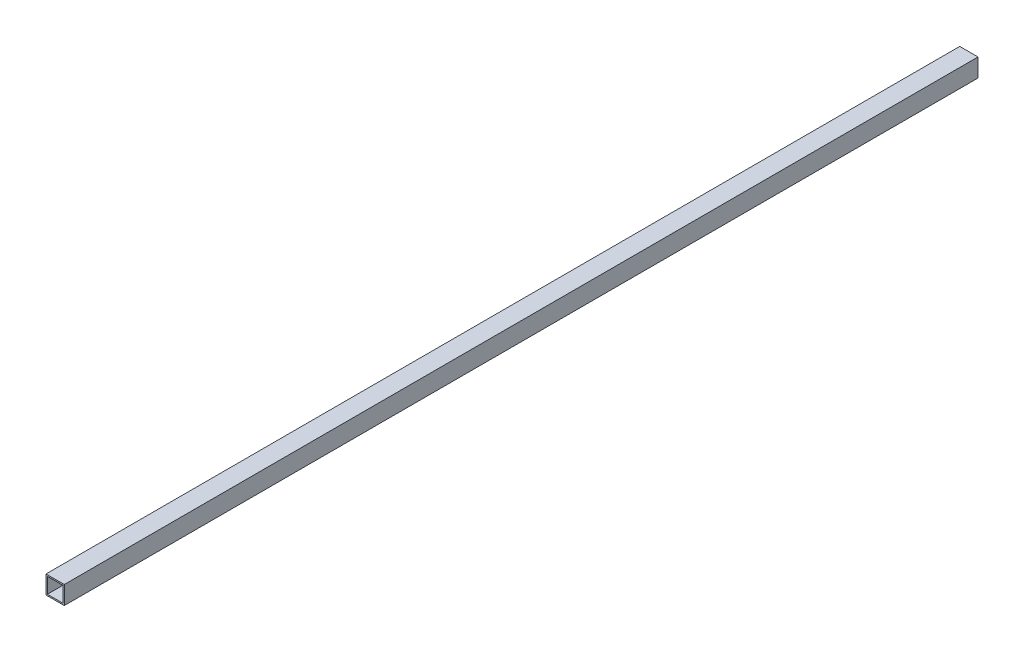
ISO-10303-21;
HEADER;
FILE_DESCRIPTION(('STEP AP214'),'2;1');
FILE_NAME('part.step','',(''),(''),'','','');
FILE_SCHEMA(('AUTOMOTIVE_DESIGN { 1 0 10303 214 1 1 1 1 }'));
ENDSEC;
DATA;
#1=APPLICATION_CONTEXT('core data for automotive mechanical design processes');
#2=APPLICATION_PROTOCOL_DEFINITION('international standard','automotive_design',2000,#1);
#3=PRODUCT_CONTEXT('',#1,'mechanical');
#4=PRODUCT('Part','Part','',(#3));
#5=PRODUCT_RELATED_PRODUCT_CATEGORY('part','',(#4));
#6=PRODUCT_DEFINITION_FORMATION('','',#4);
#7=PRODUCT_DEFINITION_CONTEXT('part definition',#1,'design');
#8=PRODUCT_DEFINITION('design','',#6,#7);
#9=PRODUCT_DEFINITION_SHAPE('','',#8);
#10=(LENGTH_UNIT() NAMED_UNIT(*) SI_UNIT(.MILLI.,.METRE.));
#11=(NAMED_UNIT(*) PLANE_ANGLE_UNIT() SI_UNIT($,.RADIAN.));
#12=(NAMED_UNIT(*) SI_UNIT($,.STERADIAN.) SOLID_ANGLE_UNIT());
#13=UNCERTAINTY_MEASURE_WITH_UNIT(LENGTH_MEASURE(1.E-05),#10,'distance_accuracy_value','');
#14=(GEOMETRIC_REPRESENTATION_CONTEXT(3) GLOBAL_UNCERTAINTY_ASSIGNED_CONTEXT((#13)) GLOBAL_UNIT_ASSIGNED_CONTEXT((#10,
#11,#12)) REPRESENTATION_CONTEXT('',''));
#15=CARTESIAN_POINT('',(0.,0.,0.));
#16=DIRECTION('',(0.,0.,1.));
#17=DIRECTION('',(1.,0.,0.));
#18=AXIS2_PLACEMENT_3D('',#15,#16,#17);
#19=CARTESIAN_POINT('',(20.,20.,2000.));
#20=DIRECTION('',(-1.,0.,0.));
#21=DIRECTION('',(0.,-1.,0.));
#22=AXIS2_PLACEMENT_3D('',#19,#20,#21);
#23=PLANE('',#22);
#24=DIRECTION('',(0.,1.,0.));
#25=VECTOR('',#24,1.);
#26=CARTESIAN_POINT('',(20.,20.,0.));
#27=LINE('',#26,#25);
#28=CARTESIAN_POINT('',(20.,-20.,0.));
#29=VERTEX_POINT('',#28);
#30=CARTESIAN_POINT('',(20.,20.,0.));
#31=VERTEX_POINT('',#30);
#32=EDGE_CURVE('E133',#29,#31,#27,.T.);
#33=ORIENTED_EDGE('',*,*,#32,.T.);
#34=DIRECTION('',(0.,0.,-1.));
#35=VECTOR('',#34,1.);
#36=CARTESIAN_POINT('',(20.,20.,2000.));
#37=LINE('',#36,#35);
#38=CARTESIAN_POINT('',(20.,20.,2000.));
#39=VERTEX_POINT('',#38);
#40=EDGE_CURVE('E11',#39,#31,#37,.T.);
#41=ORIENTED_EDGE('',*,*,#40,.F.);
#42=DIRECTION('',(0.,1.,0.));
#43=VECTOR('',#42,1.);
#44=CARTESIAN_POINT('',(20.,20.,2000.));
#45=LINE('',#44,#43);
#46=CARTESIAN_POINT('',(20.,-20.,2000.));
#47=VERTEX_POINT('',#46);
#48=EDGE_CURVE('E137',#47,#39,#45,.T.);
#49=ORIENTED_EDGE('',*,*,#48,.F.);
#50=DIRECTION('',(0.,0.,-1.));
#51=VECTOR('',#50,1.);
#52=CARTESIAN_POINT('',(20.,-20.,2000.));
#53=LINE('',#52,#51);
#54=EDGE_CURVE('E147',#47,#29,#53,.T.);
#55=ORIENTED_EDGE('',*,*,#54,.T.);
#56=EDGE_LOOP('',(#33,#41,#49,#55));
#57=FACE_BOUND('',#56,.T.);
#58=ADVANCED_FACE('F36',(#57),#23,.F.);
#59=CARTESIAN_POINT('',(-20.,20.,2000.));
#60=DIRECTION('',(0.,-1.,0.));
#61=DIRECTION('',(0.,0.,-1.));
#62=AXIS2_PLACEMENT_3D('',#59,#60,#61);
#63=PLANE('',#62);
#64=DIRECTION('',(-1.,0.,0.));
#65=VECTOR('',#64,1.);
#66=CARTESIAN_POINT('',(-20.,20.,0.));
#67=LINE('',#66,#65);
#68=CARTESIAN_POINT('',(-20.,20.,0.));
#69=VERTEX_POINT('',#68);
#70=EDGE_CURVE('E150',#31,#69,#67,.T.);
#71=ORIENTED_EDGE('',*,*,#70,.T.);
#72=DIRECTION('',(0.,0.,-1.));
#73=VECTOR('',#72,1.);
#74=CARTESIAN_POINT('',(-20.,20.,2000.));
#75=LINE('',#74,#73);
#76=CARTESIAN_POINT('',(-20.,20.,2000.));
#77=VERTEX_POINT('',#76);
#78=EDGE_CURVE('E43',#77,#69,#75,.T.);
#79=ORIENTED_EDGE('',*,*,#78,.F.);
#80=DIRECTION('',(-1.,0.,0.));
#81=VECTOR('',#80,1.);
#82=CARTESIAN_POINT('',(-20.,20.,2000.));
#83=LINE('',#82,#81);
#84=EDGE_CURVE('E140',#39,#77,#83,.T.);
#85=ORIENTED_EDGE('',*,*,#84,.F.);
#86=ORIENTED_EDGE('',*,*,#40,.T.);
#87=EDGE_LOOP('',(#71,#79,#85,#86));
#88=FACE_BOUND('',#87,.T.);
#89=ADVANCED_FACE('F178',(#88),#63,.F.);
#90=CARTESIAN_POINT('',(-20.,20.,2000.));
#91=DIRECTION('',(1.,0.,0.));
#92=DIRECTION('',(0.,0.,-1.));
#93=AXIS2_PLACEMENT_3D('',#90,#91,#92);
#94=PLANE('',#93);
#95=DIRECTION('',(0.,-1.,0.));
#96=VECTOR('',#95,1.);
#97=CARTESIAN_POINT('',(-20.,20.,0.));
#98=LINE('',#97,#96);
#99=CARTESIAN_POINT('',(-20.,-20.,0.));
#100=VERTEX_POINT('',#99);
#101=EDGE_CURVE('E152',#69,#100,#98,.T.);
#102=ORIENTED_EDGE('',*,*,#101,.T.);
#103=DIRECTION('',(0.,0.,-1.));
#104=VECTOR('',#103,1.);
#105=CARTESIAN_POINT('',(-20.,-20.,2000.));
#106=LINE('',#105,#104);
#107=CARTESIAN_POINT('',(-20.,-20.,2000.));
#108=VERTEX_POINT('',#107);
#109=EDGE_CURVE('E157',#108,#100,#106,.T.);
#110=ORIENTED_EDGE('',*,*,#109,.F.);
#111=DIRECTION('',(0.,-1.,0.));
#112=VECTOR('',#111,1.);
#113=CARTESIAN_POINT('',(-20.,20.,2000.));
#114=LINE('',#113,#112);
#115=EDGE_CURVE('E143',#77,#108,#114,.T.);
#116=ORIENTED_EDGE('',*,*,#115,.F.);
#117=ORIENTED_EDGE('',*,*,#78,.T.);
#118=EDGE_LOOP('',(#102,#110,#116,#117));
#119=FACE_BOUND('',#118,.T.);
#120=ADVANCED_FACE('F164',(#119),#94,.F.);
#121=CARTESIAN_POINT('',(-20.,-20.,2000.));
#122=DIRECTION('',(0.,1.,0.));
#123=DIRECTION('',(0.,0.,1.));
#124=AXIS2_PLACEMENT_3D('',#121,#122,#123);
#125=PLANE('',#124);
#126=DIRECTION('',(1.,0.,0.));
#127=VECTOR('',#126,1.);
#128=CARTESIAN_POINT('',(-20.,-20.,0.));
#129=LINE('',#128,#127);
#130=EDGE_CURVE('E141',#100,#29,#129,.T.);
#131=ORIENTED_EDGE('',*,*,#130,.T.);
#132=ORIENTED_EDGE('',*,*,#54,.F.);
#133=DIRECTION('',(1.,0.,0.));
#134=VECTOR('',#133,1.);
#135=CARTESIAN_POINT('',(-20.,-20.,2000.));
#136=LINE('',#135,#134);
#137=EDGE_CURVE('E145',#108,#47,#136,.T.);
#138=ORIENTED_EDGE('',*,*,#137,.F.);
#139=ORIENTED_EDGE('',*,*,#109,.T.);
#140=EDGE_LOOP('',(#131,#132,#138,#139));
#141=FACE_BOUND('',#140,.T.);
#142=ADVANCED_FACE('F173',(#141),#125,.F.);
#143=CARTESIAN_POINT('',(0.,0.,2000.));
#144=DIRECTION('',(0.,0.,1.));
#145=DIRECTION('',(1.,0.,0.));
#146=AXIS2_PLACEMENT_3D('',#143,#144,#145);
#147=PLANE('',#146);
#148=DIRECTION('',(0.,1.,0.));
#149=VECTOR('',#148,1.);
#150=CARTESIAN_POINT('',(-17.,17.,2000.));
#151=LINE('',#150,#149);
#152=CARTESIAN_POINT('',(-17.,-17.,2000.));
#153=VERTEX_POINT('',#152);
#154=CARTESIAN_POINT('',(-17.,17.,2000.));
#155=VERTEX_POINT('',#154);
#156=EDGE_CURVE('E102',#153,#155,#151,.T.);
#157=ORIENTED_EDGE('',*,*,#156,.T.);
#158=DIRECTION('',(1.,0.,0.));
#159=VECTOR('',#158,1.);
#160=CARTESIAN_POINT('',(17.,17.,2000.));
#161=LINE('',#160,#159);
#162=CARTESIAN_POINT('',(17.,17.,2000.));
#163=VERTEX_POINT('',#162);
#164=EDGE_CURVE('E111',#155,#163,#161,.T.);
#165=ORIENTED_EDGE('',*,*,#164,.T.);
#166=DIRECTION('',(0.,-1.,0.));
#167=VECTOR('',#166,1.);
#168=CARTESIAN_POINT('',(17.,17.,2000.));
#169=LINE('',#168,#167);
#170=CARTESIAN_POINT('',(17.,-17.,2000.));
#171=VERTEX_POINT('',#170);
#172=EDGE_CURVE('E50',#163,#171,#169,.T.);
#173=ORIENTED_EDGE('',*,*,#172,.T.);
#174=DIRECTION('',(-1.,0.,0.));
#175=VECTOR('',#174,1.);
#176=CARTESIAN_POINT('',(17.,-17.,2000.));
#177=LINE('',#176,#175);
#178=EDGE_CURVE('E108',#171,#153,#177,.T.);
#179=ORIENTED_EDGE('',*,*,#178,.T.);
#180=EDGE_LOOP('',(#157,#165,#173,#179));
#181=FACE_BOUND('',#180,.T.);
#182=ORIENTED_EDGE('',*,*,#48,.T.);
#183=ORIENTED_EDGE('',*,*,#84,.T.);
#184=ORIENTED_EDGE('',*,*,#115,.T.);
#185=ORIENTED_EDGE('',*,*,#137,.T.);
#186=EDGE_LOOP('',(#182,#183,#184,#185));
#187=FACE_BOUND('',#186,.T.);
#188=ADVANCED_FACE('F115',(#181,#187),#147,.T.);
#189=CARTESIAN_POINT('',(0.,0.,0.));
#190=DIRECTION('',(0.,0.,1.));
#191=DIRECTION('',(1.,0.,0.));
#192=AXIS2_PLACEMENT_3D('',#189,#190,#191);
#193=PLANE('',#192);
#194=DIRECTION('',(1.,0.,0.));
#195=VECTOR('',#194,1.);
#196=CARTESIAN_POINT('',(17.,17.,0.));
#197=LINE('',#196,#195);
#198=CARTESIAN_POINT('',(-17.,17.,0.));
#199=VERTEX_POINT('',#198);
#200=CARTESIAN_POINT('',(17.,17.,0.));
#201=VERTEX_POINT('',#200);
#202=EDGE_CURVE('E127',#199,#201,#197,.T.);
#203=ORIENTED_EDGE('',*,*,#202,.F.);
#204=DIRECTION('',(0.,1.,0.));
#205=VECTOR('',#204,1.);
#206=CARTESIAN_POINT('',(-17.,17.,0.));
#207=LINE('',#206,#205);
#208=CARTESIAN_POINT('',(-17.,-17.,0.));
#209=VERTEX_POINT('',#208);
#210=EDGE_CURVE('E58',#209,#199,#207,.T.);
#211=ORIENTED_EDGE('',*,*,#210,.F.);
#212=DIRECTION('',(-1.,0.,0.));
#213=VECTOR('',#212,1.);
#214=CARTESIAN_POINT('',(17.,-17.,0.));
#215=LINE('',#214,#213);
#216=CARTESIAN_POINT('',(17.,-17.,0.));
#217=VERTEX_POINT('',#216);
#218=EDGE_CURVE('E118',#217,#209,#215,.T.);
#219=ORIENTED_EDGE('',*,*,#218,.F.);
#220=DIRECTION('',(0.,-1.,0.));
#221=VECTOR('',#220,1.);
#222=CARTESIAN_POINT('',(17.,17.,0.));
#223=LINE('',#222,#221);
#224=EDGE_CURVE('E121',#201,#217,#223,.T.);
#225=ORIENTED_EDGE('',*,*,#224,.F.);
#226=EDGE_LOOP('',(#203,#211,#219,#225));
#227=FACE_BOUND('',#226,.T.);
#228=ORIENTED_EDGE('',*,*,#32,.F.);
#229=ORIENTED_EDGE('',*,*,#130,.F.);
#230=ORIENTED_EDGE('',*,*,#101,.F.);
#231=ORIENTED_EDGE('',*,*,#70,.F.);
#232=EDGE_LOOP('',(#228,#229,#230,#231));
#233=FACE_BOUND('',#232,.T.);
#234=ADVANCED_FACE('F170',(#227,#233),#193,.F.);
#235=CARTESIAN_POINT('',(-17.,17.,2000.));
#236=DIRECTION('',(-1.,0.,0.));
#237=DIRECTION('',(0.,-1.,0.));
#238=AXIS2_PLACEMENT_3D('',#235,#236,#237);
#239=PLANE('',#238);
#240=ORIENTED_EDGE('',*,*,#210,.T.);
#241=DIRECTION('',(0.,0.,-1.));
#242=VECTOR('',#241,1.);
#243=CARTESIAN_POINT('',(-17.,17.,2000.));
#244=LINE('',#243,#242);
#245=EDGE_CURVE('E98',#155,#199,#244,.T.);
#246=ORIENTED_EDGE('',*,*,#245,.F.);
#247=ORIENTED_EDGE('',*,*,#156,.F.);
#248=DIRECTION('',(0.,0.,-1.));
#249=VECTOR('',#248,1.);
#250=CARTESIAN_POINT('',(-17.,-17.,2000.));
#251=LINE('',#250,#249);
#252=EDGE_CURVE('E131',#153,#209,#251,.T.);
#253=ORIENTED_EDGE('',*,*,#252,.T.);
#254=EDGE_LOOP('',(#240,#246,#247,#253));
#255=FACE_BOUND('',#254,.T.);
#256=ADVANCED_FACE('F100',(#255),#239,.F.);
#257=CARTESIAN_POINT('',(17.,-17.,2000.));
#258=DIRECTION('',(0.,-1.,0.));
#259=DIRECTION('',(0.,0.,-1.));
#260=AXIS2_PLACEMENT_3D('',#257,#258,#259);
#261=PLANE('',#260);
#262=ORIENTED_EDGE('',*,*,#218,.T.);
#263=ORIENTED_EDGE('',*,*,#252,.F.);
#264=ORIENTED_EDGE('',*,*,#178,.F.);
#265=DIRECTION('',(0.,0.,-1.));
#266=VECTOR('',#265,1.);
#267=CARTESIAN_POINT('',(17.,-17.,2000.));
#268=LINE('',#267,#266);
#269=EDGE_CURVE('E134',#171,#217,#268,.T.);
#270=ORIENTED_EDGE('',*,*,#269,.T.);
#271=EDGE_LOOP('',(#262,#263,#264,#270));
#272=FACE_BOUND('',#271,.T.);
#273=ADVANCED_FACE('F195',(#272),#261,.F.);
#274=CARTESIAN_POINT('',(17.,17.,2000.));
#275=DIRECTION('',(1.,0.,0.));
#276=DIRECTION('',(0.,1.,0.));
#277=AXIS2_PLACEMENT_3D('',#274,#275,#276);
#278=PLANE('',#277);
#279=ORIENTED_EDGE('',*,*,#224,.T.);
#280=ORIENTED_EDGE('',*,*,#269,.F.);
#281=ORIENTED_EDGE('',*,*,#172,.F.);
#282=DIRECTION('',(0.,0.,-1.));
#283=VECTOR('',#282,1.);
#284=CARTESIAN_POINT('',(17.,17.,2000.));
#285=LINE('',#284,#283);
#286=EDGE_CURVE('E107',#163,#201,#285,.T.);
#287=ORIENTED_EDGE('',*,*,#286,.T.);
#288=EDGE_LOOP('',(#279,#280,#281,#287));
#289=FACE_BOUND('',#288,.T.);
#290=ADVANCED_FACE('F198',(#289),#278,.F.);
#291=CARTESIAN_POINT('',(17.,17.,2000.));
#292=DIRECTION('',(0.,1.,0.));
#293=DIRECTION('',(0.,0.,1.));
#294=AXIS2_PLACEMENT_3D('',#291,#292,#293);
#295=PLANE('',#294);
#296=ORIENTED_EDGE('',*,*,#202,.T.);
#297=ORIENTED_EDGE('',*,*,#286,.F.);
#298=ORIENTED_EDGE('',*,*,#164,.F.);
#299=ORIENTED_EDGE('',*,*,#245,.T.);
#300=EDGE_LOOP('',(#296,#297,#298,#299));
#301=FACE_BOUND('',#300,.T.);
#302=ADVANCED_FACE('F112',(#301),#295,.F.);
#303=CLOSED_SHELL('',(#58,#89,#120,#142,#188,#234,#256,#273,#290,#302));
#304=MANIFOLD_SOLID_BREP('B2',#303);
#305=ADVANCED_BREP_SHAPE_REPRESENTATION('',(#18,#304),#14);
#306=SHAPE_DEFINITION_REPRESENTATION(#9,#305);
ENDSEC;
END-ISO-10303-21;
